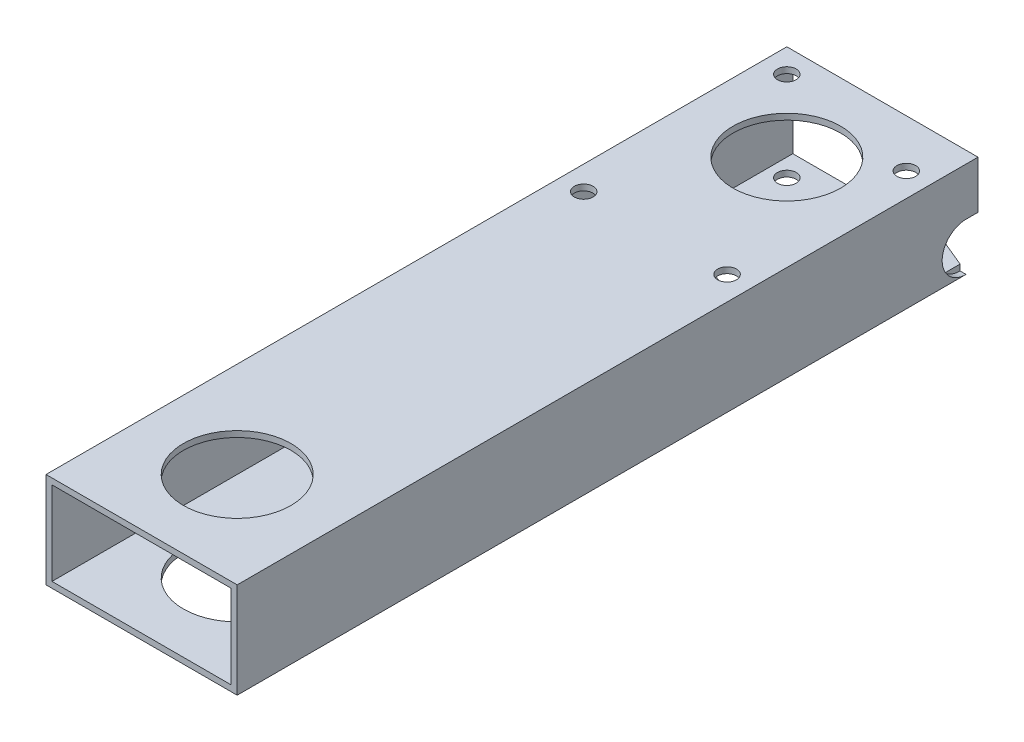
ISO-10303-21;
HEADER;
FILE_DESCRIPTION(('STEP AP214'),'2;1');
FILE_NAME('part.step','',(''),(''),'','','');
FILE_SCHEMA(('AUTOMOTIVE_DESIGN { 1 0 10303 214 1 1 1 1 }'));
ENDSEC;
DATA;
#1=APPLICATION_CONTEXT('core data for automotive mechanical design processes');
#2=APPLICATION_PROTOCOL_DEFINITION('international standard','automotive_design',2000,#1);
#3=PRODUCT_CONTEXT('',#1,'mechanical');
#4=PRODUCT('Part','Part','',(#3));
#5=PRODUCT_RELATED_PRODUCT_CATEGORY('part','',(#4));
#6=PRODUCT_DEFINITION_FORMATION('','',#4);
#7=PRODUCT_DEFINITION_CONTEXT('part definition',#1,'design');
#8=PRODUCT_DEFINITION('design','',#6,#7);
#9=PRODUCT_DEFINITION_SHAPE('','',#8);
#10=(LENGTH_UNIT() NAMED_UNIT(*) SI_UNIT(.MILLI.,.METRE.));
#11=(NAMED_UNIT(*) PLANE_ANGLE_UNIT() SI_UNIT($,.RADIAN.));
#12=(NAMED_UNIT(*) SI_UNIT($,.STERADIAN.) SOLID_ANGLE_UNIT());
#13=UNCERTAINTY_MEASURE_WITH_UNIT(LENGTH_MEASURE(1.E-05),#10,'distance_accuracy_value','');
#14=(GEOMETRIC_REPRESENTATION_CONTEXT(3) GLOBAL_UNCERTAINTY_ASSIGNED_CONTEXT((#13)) GLOBAL_UNIT_ASSIGNED_CONTEXT((#10,
#11,#12)) REPRESENTATION_CONTEXT('',''));
#15=CARTESIAN_POINT('',(0.,0.,0.));
#16=DIRECTION('',(0.,0.,1.));
#17=DIRECTION('',(1.,0.,0.));
#18=AXIS2_PLACEMENT_3D('',#15,#16,#17);
#19=CARTESIAN_POINT('',(0.,0.,98.4249994920001));
#20=DIRECTION('',(0.,0.,1.));
#21=DIRECTION('',(1.,0.,0.));
#22=AXIS2_PLACEMENT_3D('',#19,#20,#21);
#23=PLANE('',#22);
#24=DIRECTION('',(0.,-1.,0.));
#25=VECTOR('',#24,1.);
#26=CARTESIAN_POINT('',(-25.4,12.7,98.4249994920001));
#27=LINE('',#26,#25);
#28=CARTESIAN_POINT('',(-25.4,12.7,98.4249994920001));
#29=VERTEX_POINT('',#28);
#30=CARTESIAN_POINT('',(-25.4,-12.7,98.4249994920001));
#31=VERTEX_POINT('',#30);
#32=EDGE_CURVE('E192',#29,#31,#27,.T.);
#33=ORIENTED_EDGE('',*,*,#32,.T.);
#34=DIRECTION('',(1.,0.,0.));
#35=VECTOR('',#34,1.);
#36=CARTESIAN_POINT('',(-25.4,-12.7,98.4249994920001));
#37=LINE('',#36,#35);
#38=CARTESIAN_POINT('',(25.4,-12.7,98.4249994920001));
#39=VERTEX_POINT('',#38);
#40=EDGE_CURVE('E195',#31,#39,#37,.T.);
#41=ORIENTED_EDGE('',*,*,#40,.T.);
#42=DIRECTION('',(0.,1.,0.));
#43=VECTOR('',#42,1.);
#44=CARTESIAN_POINT('',(25.4,-12.7,98.4249994920001));
#45=LINE('',#44,#43);
#46=CARTESIAN_POINT('',(25.4,12.7,98.4249994920001));
#47=VERTEX_POINT('',#46);
#48=EDGE_CURVE('E197',#39,#47,#45,.T.);
#49=ORIENTED_EDGE('',*,*,#48,.T.);
#50=DIRECTION('',(-1.,0.,0.));
#51=VECTOR('',#50,1.);
#52=CARTESIAN_POINT('',(25.4,12.7,98.4249994920001));
#53=LINE('',#52,#51);
#54=EDGE_CURVE('E199',#47,#29,#53,.T.);
#55=ORIENTED_EDGE('',*,*,#54,.T.);
#56=EDGE_LOOP('',(#33,#41,#49,#55));
#57=FACE_BOUND('',#56,.T.);
#58=DIRECTION('',(1.,0.,0.));
#59=VECTOR('',#58,1.);
#60=CARTESIAN_POINT('',(-23.8125,-11.1125,98.4249994920001));
#61=LINE('',#60,#59);
#62=CARTESIAN_POINT('',(-23.8125,-11.1125,98.4249994920001));
#63=VERTEX_POINT('',#62);
#64=CARTESIAN_POINT('',(23.8125,-11.1125,98.4249994920001));
#65=VERTEX_POINT('',#64);
#66=EDGE_CURVE('E179',#63,#65,#61,.T.);
#67=ORIENTED_EDGE('',*,*,#66,.F.);
#68=DIRECTION('',(0.,-1.,0.));
#69=VECTOR('',#68,1.);
#70=CARTESIAN_POINT('',(-23.8125,11.1125,98.4249994920001));
#71=LINE('',#70,#69);
#72=CARTESIAN_POINT('',(-23.8125,11.1125,98.4249994920001));
#73=VERTEX_POINT('',#72);
#74=EDGE_CURVE('E177',#73,#63,#71,.T.);
#75=ORIENTED_EDGE('',*,*,#74,.F.);
#76=DIRECTION('',(-1.,0.,0.));
#77=VECTOR('',#76,1.);
#78=CARTESIAN_POINT('',(23.8125,11.1125,98.4249994920001));
#79=LINE('',#78,#77);
#80=CARTESIAN_POINT('',(23.8125,11.1125,98.4249994920001));
#81=VERTEX_POINT('',#80);
#82=EDGE_CURVE('E183',#81,#73,#79,.T.);
#83=ORIENTED_EDGE('',*,*,#82,.F.);
#84=DIRECTION('',(0.,1.,0.));
#85=VECTOR('',#84,1.);
#86=CARTESIAN_POINT('',(23.8125,-11.1125,98.4249994920001));
#87=LINE('',#86,#85);
#88=EDGE_CURVE('E181',#65,#81,#87,.T.);
#89=ORIENTED_EDGE('',*,*,#88,.F.);
#90=EDGE_LOOP('',(#67,#75,#83,#89));
#91=FACE_BOUND('',#90,.T.);
#92=ADVANCED_FACE('F43',(#57,#91),#23,.T.);
#93=CARTESIAN_POINT('',(-25.4,12.7,98.4249994920001));
#94=DIRECTION('',(1.,0.,0.));
#95=DIRECTION('',(0.,0.,-1.));
#96=AXIS2_PLACEMENT_3D('',#93,#94,#95);
#97=PLANE('',#96);
#98=DIRECTION('',(0.,0.,-1.));
#99=VECTOR('',#98,1.);
#100=CARTESIAN_POINT('',(-25.4,12.7,98.4249994920001));
#101=LINE('',#100,#99);
#102=CARTESIAN_POINT('',(-25.4,12.7,-98.4249994920001));
#103=VERTEX_POINT('',#102);
#104=EDGE_CURVE('E201',#29,#103,#101,.T.);
#105=ORIENTED_EDGE('',*,*,#104,.T.);
#106=DIRECTION('',(0.,-1.,0.));
#107=VECTOR('',#106,1.);
#108=CARTESIAN_POINT('',(-25.4,12.7,-98.4249994920001));
#109=LINE('',#108,#107);
#110=CARTESIAN_POINT('',(-25.4,-12.7,-98.4249994920001));
#111=VERTEX_POINT('',#110);
#112=EDGE_CURVE('E167',#103,#111,#109,.T.);
#113=ORIENTED_EDGE('',*,*,#112,.T.);
#114=DIRECTION('',(0.,0.,-1.));
#115=VECTOR('',#114,1.);
#116=CARTESIAN_POINT('',(-25.4,-12.7,98.4249994920001));
#117=LINE('',#116,#115);
#118=EDGE_CURVE('E11',#31,#111,#117,.T.);
#119=ORIENTED_EDGE('',*,*,#118,.F.);
#120=ORIENTED_EDGE('',*,*,#32,.F.);
#121=EDGE_LOOP('',(#105,#113,#119,#120));
#122=FACE_BOUND('',#121,.T.);
#123=ADVANCED_FACE('F45',(#122),#97,.F.);
#124=CARTESIAN_POINT('',(-25.4,-12.7,98.4249994920001));
#125=DIRECTION('',(0.,1.,0.));
#126=DIRECTION('',(-1.,0.,0.));
#127=AXIS2_PLACEMENT_3D('',#124,#125,#126);
#128=PLANE('',#127);
#129=CARTESIAN_POINT('',(19.0500000000008,-12.7,-85.7249994917966));
#130=DIRECTION('',(0.,-1.,0.));
#131=DIRECTION('',(0.,0.,-1.));
#132=AXIS2_PLACEMENT_3D('',#129,#130,#131);
#133=CIRCLE('',#132,2.48919999999999);
#134=CARTESIAN_POINT('',(19.0500000000008,-12.7,-88.2141994917966));
#135=VERTEX_POINT('',#134);
#136=EDGE_CURVE('E622',#135,#135,#133,.T.);
#137=ORIENTED_EDGE('',*,*,#136,.F.);
#138=EDGE_LOOP('',(#137));
#139=FACE_BOUND('',#138,.T.);
#140=CARTESIAN_POINT('',(-19.0500000000001,-12.7,-92.0749994917965));
#141=DIRECTION('',(0.,-1.,0.));
#142=DIRECTION('',(0.,0.,-1.));
#143=AXIS2_PLACEMENT_3D('',#140,#141,#142);
#144=CIRCLE('',#143,2.48919999999999);
#145=CARTESIAN_POINT('',(-19.0500000000001,-12.7,-94.5641994917965));
#146=VERTEX_POINT('',#145);
#147=EDGE_CURVE('E230',#146,#146,#144,.T.);
#148=ORIENTED_EDGE('',*,*,#147,.F.);
#149=EDGE_LOOP('',(#148));
#150=FACE_BOUND('',#149,.T.);
#151=CARTESIAN_POINT('',(-19.0500000000001,-12.7,-38.0999994917965));
#152=DIRECTION('',(0.,-1.,0.));
#153=DIRECTION('',(0.,0.,-1.));
#154=AXIS2_PLACEMENT_3D('',#151,#152,#153);
#155=CIRCLE('',#154,2.48919999999999);
#156=CARTESIAN_POINT('',(-19.0500000000001,-12.7,-40.5891994917965));
#157=VERTEX_POINT('',#156);
#158=EDGE_CURVE('E227',#157,#157,#155,.T.);
#159=ORIENTED_EDGE('',*,*,#158,.F.);
#160=EDGE_LOOP('',(#159));
#161=FACE_BOUND('',#160,.T.);
#162=CARTESIAN_POINT('',(19.0500000000007,-12.7,-38.0999994917965));
#163=DIRECTION('',(0.,-1.,0.));
#164=DIRECTION('',(0.,0.,-1.));
#165=AXIS2_PLACEMENT_3D('',#162,#163,#164);
#166=CIRCLE('',#165,2.48919999999999);
#167=CARTESIAN_POINT('',(19.0500000000007,-12.7,-40.5891994917965));
#168=VERTEX_POINT('',#167);
#169=EDGE_CURVE('E245',#168,#168,#166,.T.);
#170=ORIENTED_EDGE('',*,*,#169,.F.);
#171=EDGE_LOOP('',(#170));
#172=FACE_BOUND('',#171,.T.);
#173=CARTESIAN_POINT('',(0.,-12.7,-73.025));
#174=DIRECTION('',(0.,-1.,0.));
#175=DIRECTION('',(1.,0.,0.));
#176=AXIS2_PLACEMENT_3D('',#173,#174,#175);
#177=CIRCLE('',#176,14.2875);
#178=CARTESIAN_POINT('',(14.2875,-12.7,-73.025));
#179=VERTEX_POINT('',#178);
#180=EDGE_CURVE('E281',#179,#179,#177,.T.);
#181=ORIENTED_EDGE('',*,*,#180,.F.);
#182=EDGE_LOOP('',(#181));
#183=FACE_BOUND('',#182,.T.);
#184=CARTESIAN_POINT('',(0.,-12.7,73.025));
#185=DIRECTION('',(0.,-1.,0.));
#186=DIRECTION('',(1.,0.,0.));
#187=AXIS2_PLACEMENT_3D('',#184,#185,#186);
#188=CIRCLE('',#187,14.2875);
#189=CARTESIAN_POINT('',(14.2875,-12.7,73.025));
#190=VERTEX_POINT('',#189);
#191=EDGE_CURVE('E284',#190,#190,#188,.T.);
#192=ORIENTED_EDGE('',*,*,#191,.F.);
#193=EDGE_LOOP('',(#192));
#194=FACE_BOUND('',#193,.T.);
#195=DIRECTION('',(1.,0.,0.));
#196=VECTOR('',#195,1.);
#197=CARTESIAN_POINT('',(-25.4,-12.7,-98.4249994920001));
#198=LINE('',#197,#196);
#199=CARTESIAN_POINT('',(16.1925,-12.7,-98.4249994920001));
#200=VERTEX_POINT('',#199);
#201=EDGE_CURVE('E170',#111,#200,#198,.T.);
#202=ORIENTED_EDGE('',*,*,#201,.T.);
#203=DIRECTION('',(-0.923076923076923,0.,-0.384615384615384));
#204=VECTOR('',#203,1.);
#205=CARTESIAN_POINT('',(23.8125,-12.7,-95.2499994920001));
#206=LINE('',#205,#204);
#207=CARTESIAN_POINT('',(23.8125,-12.7,-95.2499994920001));
#208=VERTEX_POINT('',#207);
#209=EDGE_CURVE('E135',#208,#200,#206,.T.);
#210=ORIENTED_EDGE('',*,*,#209,.F.);
#211=DIRECTION('',(1.,0.,0.));
#212=VECTOR('',#211,1.);
#213=CARTESIAN_POINT('',(23.8125,-12.7,-95.2499994920001));
#214=LINE('',#213,#212);
#215=CARTESIAN_POINT('',(25.4,-12.7,-95.2499994920001));
#216=VERTEX_POINT('',#215);
#217=EDGE_CURVE('E266',#208,#216,#214,.T.);
#218=ORIENTED_EDGE('',*,*,#217,.T.);
#219=DIRECTION('',(0.,0.,-1.));
#220=VECTOR('',#219,1.);
#221=CARTESIAN_POINT('',(25.4,-12.7,98.4249994920001));
#222=LINE('',#221,#220);
#223=EDGE_CURVE('E52',#39,#216,#222,.T.);
#224=ORIENTED_EDGE('',*,*,#223,.F.);
#225=ORIENTED_EDGE('',*,*,#40,.F.);
#226=ORIENTED_EDGE('',*,*,#118,.T.);
#227=EDGE_LOOP('',(#202,#210,#218,#224,#225,#226));
#228=FACE_BOUND('',#227,.T.);
#229=ADVANCED_FACE('F311',(#139,#150,#161,#172,#183,#194,#228),#128,.F.);
#230=CARTESIAN_POINT('',(25.4,-12.7,98.4249994920001));
#231=DIRECTION('',(-1.,0.,0.));
#232=DIRECTION('',(0.,0.,1.));
#233=AXIS2_PLACEMENT_3D('',#230,#231,#232);
#234=PLANE('',#233);
#235=ORIENTED_EDGE('',*,*,#223,.T.);
#236=CARTESIAN_POINT('',(25.4,-6.35,-95.2499994920001));
#237=DIRECTION('',(1.,0.,0.));
#238=DIRECTION('',(0.,0.,-1.));
#239=AXIS2_PLACEMENT_3D('',#236,#237,#238);
#240=CIRCLE('',#239,6.35);
#241=CARTESIAN_POINT('',(25.4,0.,-95.2499994920001));
#242=VERTEX_POINT('',#241);
#243=EDGE_CURVE('E140',#242,#216,#240,.T.);
#244=ORIENTED_EDGE('',*,*,#243,.F.);
#245=DIRECTION('',(0.,0.,1.));
#246=VECTOR('',#245,1.);
#247=CARTESIAN_POINT('',(25.4,0.,-95.2499994920001));
#248=LINE('',#247,#246);
#249=CARTESIAN_POINT('',(25.4,0.,-98.4249994920001));
#250=VERTEX_POINT('',#249);
#251=EDGE_CURVE('E268',#250,#242,#248,.T.);
#252=ORIENTED_EDGE('',*,*,#251,.F.);
#253=DIRECTION('',(0.,1.,0.));
#254=VECTOR('',#253,1.);
#255=CARTESIAN_POINT('',(25.4,-12.7,-98.4249994920001));
#256=LINE('',#255,#254);
#257=CARTESIAN_POINT('',(25.4,12.7,-98.4249994920001));
#258=VERTEX_POINT('',#257);
#259=EDGE_CURVE('E172',#250,#258,#256,.T.);
#260=ORIENTED_EDGE('',*,*,#259,.T.);
#261=DIRECTION('',(0.,0.,-1.));
#262=VECTOR('',#261,1.);
#263=CARTESIAN_POINT('',(25.4,12.7,98.4249994920001));
#264=LINE('',#263,#262);
#265=EDGE_CURVE('E203',#47,#258,#264,.T.);
#266=ORIENTED_EDGE('',*,*,#265,.F.);
#267=ORIENTED_EDGE('',*,*,#48,.F.);
#268=EDGE_LOOP('',(#235,#244,#252,#260,#266,#267));
#269=FACE_BOUND('',#268,.T.);
#270=ADVANCED_FACE('F314',(#269),#234,.F.);
#271=CARTESIAN_POINT('',(25.4,12.7,98.4249994920001));
#272=DIRECTION('',(0.,-1.,0.));
#273=DIRECTION('',(1.,0.,0.));
#274=AXIS2_PLACEMENT_3D('',#271,#272,#273);
#275=PLANE('',#274);
#276=CARTESIAN_POINT('',(19.0500000000008,12.7,-85.7249994917966));
#277=DIRECTION('',(0.,-1.,0.));
#278=DIRECTION('',(0.,0.,-1.));
#279=AXIS2_PLACEMENT_3D('',#276,#277,#278);
#280=CIRCLE('',#279,2.48919999999999);
#281=CARTESIAN_POINT('',(19.0500000000008,12.7,-88.2141994917966));
#282=VERTEX_POINT('',#281);
#283=EDGE_CURVE('E623',#282,#282,#280,.T.);
#284=ORIENTED_EDGE('',*,*,#283,.T.);
#285=EDGE_LOOP('',(#284));
#286=FACE_BOUND('',#285,.T.);
#287=CARTESIAN_POINT('',(-19.0500000000001,12.7,-92.0749994917965));
#288=DIRECTION('',(0.,-1.,0.));
#289=DIRECTION('',(0.,0.,-1.));
#290=AXIS2_PLACEMENT_3D('',#287,#288,#289);
#291=CIRCLE('',#290,2.48919999999999);
#292=CARTESIAN_POINT('',(-19.0500000000001,12.7,-94.5641994917965));
#293=VERTEX_POINT('',#292);
#294=EDGE_CURVE('E223',#293,#293,#291,.T.);
#295=ORIENTED_EDGE('',*,*,#294,.T.);
#296=EDGE_LOOP('',(#295));
#297=FACE_BOUND('',#296,.T.);
#298=CARTESIAN_POINT('',(-19.0500000000001,12.7,-38.0999994917965));
#299=DIRECTION('',(0.,-1.,0.));
#300=DIRECTION('',(0.,0.,-1.));
#301=AXIS2_PLACEMENT_3D('',#298,#299,#300);
#302=CIRCLE('',#301,2.48919999999999);
#303=CARTESIAN_POINT('',(-19.0500000000001,12.7,-40.5891994917965));
#304=VERTEX_POINT('',#303);
#305=EDGE_CURVE('E219',#304,#304,#302,.T.);
#306=ORIENTED_EDGE('',*,*,#305,.T.);
#307=EDGE_LOOP('',(#306));
#308=FACE_BOUND('',#307,.T.);
#309=CARTESIAN_POINT('',(19.0500000000007,12.7,-38.0999994917965));
#310=DIRECTION('',(0.,-1.,0.));
#311=DIRECTION('',(0.,0.,-1.));
#312=AXIS2_PLACEMENT_3D('',#309,#310,#311);
#313=CIRCLE('',#312,2.48919999999999);
#314=CARTESIAN_POINT('',(19.0500000000007,12.7,-40.5891994917965));
#315=VERTEX_POINT('',#314);
#316=EDGE_CURVE('E248',#315,#315,#313,.T.);
#317=ORIENTED_EDGE('',*,*,#316,.T.);
#318=EDGE_LOOP('',(#317));
#319=FACE_BOUND('',#318,.T.);
#320=CARTESIAN_POINT('',(0.,12.7,-73.025));
#321=DIRECTION('',(0.,-1.,0.));
#322=DIRECTION('',(1.,0.,0.));
#323=AXIS2_PLACEMENT_3D('',#320,#321,#322);
#324=CIRCLE('',#323,14.2875);
#325=CARTESIAN_POINT('',(14.2875,12.7,-73.025));
#326=VERTEX_POINT('',#325);
#327=EDGE_CURVE('E212',#326,#326,#324,.T.);
#328=ORIENTED_EDGE('',*,*,#327,.T.);
#329=EDGE_LOOP('',(#328));
#330=FACE_BOUND('',#329,.T.);
#331=CARTESIAN_POINT('',(0.,12.7,73.025));
#332=DIRECTION('',(0.,-1.,0.));
#333=DIRECTION('',(1.,0.,0.));
#334=AXIS2_PLACEMENT_3D('',#331,#332,#333);
#335=CIRCLE('',#334,14.2875);
#336=CARTESIAN_POINT('',(14.2875,12.7,73.025));
#337=VERTEX_POINT('',#336);
#338=EDGE_CURVE('E278',#337,#337,#335,.T.);
#339=ORIENTED_EDGE('',*,*,#338,.T.);
#340=EDGE_LOOP('',(#339));
#341=FACE_BOUND('',#340,.T.);
#342=ORIENTED_EDGE('',*,*,#265,.T.);
#343=DIRECTION('',(-1.,0.,0.));
#344=VECTOR('',#343,1.);
#345=CARTESIAN_POINT('',(25.4,12.7,-98.4249994920001));
#346=LINE('',#345,#344);
#347=EDGE_CURVE('E174',#258,#103,#346,.T.);
#348=ORIENTED_EDGE('',*,*,#347,.T.);
#349=ORIENTED_EDGE('',*,*,#104,.F.);
#350=ORIENTED_EDGE('',*,*,#54,.F.);
#351=EDGE_LOOP('',(#342,#348,#349,#350));
#352=FACE_BOUND('',#351,.T.);
#353=ADVANCED_FACE('F325',(#286,#297,#308,#319,#330,#341,#352),#275,.F.);
#354=CARTESIAN_POINT('',(-23.8125,11.1125,98.4249994920001));
#355=DIRECTION('',(1.,0.,0.));
#356=DIRECTION('',(0.,1.,0.));
#357=AXIS2_PLACEMENT_3D('',#354,#355,#356);
#358=PLANE('',#357);
#359=DIRECTION('',(0.,0.,-1.));
#360=VECTOR('',#359,1.);
#361=CARTESIAN_POINT('',(-23.8125,-11.1125,98.4249994920001));
#362=LINE('',#361,#360);
#363=CARTESIAN_POINT('',(-23.8125,-11.1125,-98.4249994920001));
#364=VERTEX_POINT('',#363);
#365=EDGE_CURVE('E190',#63,#364,#362,.T.);
#366=ORIENTED_EDGE('',*,*,#365,.T.);
#367=DIRECTION('',(0.,-1.,0.));
#368=VECTOR('',#367,1.);
#369=CARTESIAN_POINT('',(-23.8125,11.1125,-98.4249994920001));
#370=LINE('',#369,#368);
#371=CARTESIAN_POINT('',(-23.8125,11.1125,-98.4249994920001));
#372=VERTEX_POINT('',#371);
#373=EDGE_CURVE('E157',#372,#364,#370,.T.);
#374=ORIENTED_EDGE('',*,*,#373,.F.);
#375=DIRECTION('',(0.,0.,-1.));
#376=VECTOR('',#375,1.);
#377=CARTESIAN_POINT('',(-23.8125,11.1125,98.4249994920001));
#378=LINE('',#377,#376);
#379=EDGE_CURVE('E185',#73,#372,#378,.T.);
#380=ORIENTED_EDGE('',*,*,#379,.F.);
#381=ORIENTED_EDGE('',*,*,#74,.T.);
#382=EDGE_LOOP('',(#366,#374,#380,#381));
#383=FACE_BOUND('',#382,.T.);
#384=ADVANCED_FACE('F298',(#383),#358,.T.);
#385=CARTESIAN_POINT('',(-23.8125,-11.1125,98.4249994920001));
#386=DIRECTION('',(0.,1.,0.));
#387=DIRECTION('',(0.,0.,1.));
#388=AXIS2_PLACEMENT_3D('',#385,#386,#387);
#389=PLANE('',#388);
#390=CARTESIAN_POINT('',(19.0500000000008,-11.1125,-85.7249994917966));
#391=DIRECTION('',(0.,1.,0.));
#392=DIRECTION('',(0.,0.,1.));
#393=AXIS2_PLACEMENT_3D('',#390,#391,#392);
#394=CIRCLE('',#393,2.48919999999999);
#395=CARTESIAN_POINT('',(19.0500000000008,-11.1125,-83.2357994917966));
#396=VERTEX_POINT('',#395);
#397=EDGE_CURVE('E235',#396,#396,#394,.T.);
#398=ORIENTED_EDGE('',*,*,#397,.F.);
#399=EDGE_LOOP('',(#398));
#400=FACE_BOUND('',#399,.T.);
#401=CARTESIAN_POINT('',(-19.0500000000001,-11.1125,-92.0749994917965));
#402=DIRECTION('',(0.,1.,0.));
#403=DIRECTION('',(0.,0.,1.));
#404=AXIS2_PLACEMENT_3D('',#401,#402,#403);
#405=CIRCLE('',#404,2.48919999999999);
#406=CARTESIAN_POINT('',(-19.0500000000001,-11.1125,-89.5857994917965));
#407=VERTEX_POINT('',#406);
#408=EDGE_CURVE('E222',#407,#407,#405,.T.);
#409=ORIENTED_EDGE('',*,*,#408,.F.);
#410=EDGE_LOOP('',(#409));
#411=FACE_BOUND('',#410,.T.);
#412=CARTESIAN_POINT('',(-19.0500000000001,-11.1125,-38.0999994917965));
#413=DIRECTION('',(0.,1.,0.));
#414=DIRECTION('',(0.,0.,1.));
#415=AXIS2_PLACEMENT_3D('',#412,#413,#414);
#416=CIRCLE('',#415,2.48919999999999);
#417=CARTESIAN_POINT('',(-19.0500000000001,-11.1125,-35.6107994917966));
#418=VERTEX_POINT('',#417);
#419=EDGE_CURVE('E216',#418,#418,#416,.T.);
#420=ORIENTED_EDGE('',*,*,#419,.F.);
#421=EDGE_LOOP('',(#420));
#422=FACE_BOUND('',#421,.T.);
#423=CARTESIAN_POINT('',(19.0500000000007,-11.1125,-38.0999994917965));
#424=DIRECTION('',(0.,1.,0.));
#425=DIRECTION('',(0.,0.,1.));
#426=AXIS2_PLACEMENT_3D('',#423,#424,#425);
#427=CIRCLE('',#426,2.48919999999999);
#428=CARTESIAN_POINT('',(19.0500000000007,-11.1125,-35.6107994917965));
#429=VERTEX_POINT('',#428);
#430=EDGE_CURVE('E254',#429,#429,#427,.T.);
#431=ORIENTED_EDGE('',*,*,#430,.F.);
#432=EDGE_LOOP('',(#431));
#433=FACE_BOUND('',#432,.T.);
#434=DIRECTION('',(-0.923076923076923,0.,-0.384615384615384));
#435=VECTOR('',#434,1.);
#436=CARTESIAN_POINT('',(23.8125,-11.1125,-95.2499994920001));
#437=LINE('',#436,#435);
#438=CARTESIAN_POINT('',(23.8125,-11.1125,-95.2499994920001));
#439=VERTEX_POINT('',#438);
#440=CARTESIAN_POINT('',(16.1925,-11.1125,-98.4249994920001));
#441=VERTEX_POINT('',#440);
#442=EDGE_CURVE('E60',#439,#441,#437,.T.);
#443=ORIENTED_EDGE('',*,*,#442,.T.);
#444=DIRECTION('',(1.,0.,0.));
#445=VECTOR('',#444,1.);
#446=CARTESIAN_POINT('',(-23.8125,-11.1125,-98.4249994920001));
#447=LINE('',#446,#445);
#448=EDGE_CURVE('E149',#364,#441,#447,.T.);
#449=ORIENTED_EDGE('',*,*,#448,.F.);
#450=ORIENTED_EDGE('',*,*,#365,.F.);
#451=ORIENTED_EDGE('',*,*,#66,.T.);
#452=DIRECTION('',(0.,0.,-1.));
#453=VECTOR('',#452,1.);
#454=CARTESIAN_POINT('',(23.8125,-11.1125,98.4249994920001));
#455=LINE('',#454,#453);
#456=CARTESIAN_POINT('',(23.8125,-11.1125,-91.0498692856851));
#457=VERTEX_POINT('',#456);
#458=EDGE_CURVE('E188',#65,#457,#455,.T.);
#459=ORIENTED_EDGE('',*,*,#458,.T.);
#460=DIRECTION('',(0.,0.,-1.));
#461=VECTOR('',#460,1.);
#462=CARTESIAN_POINT('',(23.8125,-11.1125,98.4249994920001));
#463=LINE('',#462,#461);
#464=EDGE_CURVE('E152',#457,#439,#463,.T.);
#465=ORIENTED_EDGE('',*,*,#464,.T.);
#466=EDGE_LOOP('',(#443,#449,#450,#451,#459,#465));
#467=FACE_BOUND('',#466,.T.);
#468=CARTESIAN_POINT('',(0.,-11.1125,-73.025));
#469=DIRECTION('',(0.,1.,0.));
#470=DIRECTION('',(0.,0.,1.));
#471=AXIS2_PLACEMENT_3D('',#468,#469,#470);
#472=CIRCLE('',#471,14.2875);
#473=CARTESIAN_POINT('',(0.,-11.1125,-58.7375));
#474=VERTEX_POINT('',#473);
#475=EDGE_CURVE('E162',#474,#474,#472,.T.);
#476=ORIENTED_EDGE('',*,*,#475,.F.);
#477=EDGE_LOOP('',(#476));
#478=FACE_BOUND('',#477,.T.);
#479=CARTESIAN_POINT('',(0.,-11.1125,73.025));
#480=DIRECTION('',(0.,1.,0.));
#481=DIRECTION('',(0.,0.,1.));
#482=AXIS2_PLACEMENT_3D('',#479,#480,#481);
#483=CIRCLE('',#482,14.2875);
#484=CARTESIAN_POINT('',(0.,-11.1125,87.3125));
#485=VERTEX_POINT('',#484);
#486=EDGE_CURVE('E211',#485,#485,#483,.T.);
#487=ORIENTED_EDGE('',*,*,#486,.F.);
#488=EDGE_LOOP('',(#487));
#489=FACE_BOUND('',#488,.T.);
#490=ADVANCED_FACE('F146',(#400,#411,#422,#433,#467,#478,#489),#389,.T.);
#491=CARTESIAN_POINT('',(23.8125,-11.1125,98.4249994920001));
#492=DIRECTION('',(-1.,0.,0.));
#493=DIRECTION('',(0.,0.,1.));
#494=AXIS2_PLACEMENT_3D('',#491,#492,#493);
#495=PLANE('',#494);
#496=CARTESIAN_POINT('',(23.8125,-6.35,-95.2499994920001));
#497=DIRECTION('',(1.,0.,0.));
#498=DIRECTION('',(0.,0.,-1.));
#499=AXIS2_PLACEMENT_3D('',#496,#497,#498);
#500=CIRCLE('',#499,6.35);
#501=CARTESIAN_POINT('',(23.8125,0.,-95.2499994920001));
#502=VERTEX_POINT('',#501);
#503=EDGE_CURVE('E259',#502,#457,#500,.T.);
#504=ORIENTED_EDGE('',*,*,#503,.T.);
#505=ORIENTED_EDGE('',*,*,#458,.F.);
#506=ORIENTED_EDGE('',*,*,#88,.T.);
#507=DIRECTION('',(0.,0.,-1.));
#508=VECTOR('',#507,1.);
#509=CARTESIAN_POINT('',(23.8125,11.1125,98.4249994920001));
#510=LINE('',#509,#508);
#511=CARTESIAN_POINT('',(23.8125,11.1125,-98.4249994920001));
#512=VERTEX_POINT('',#511);
#513=EDGE_CURVE('E68',#81,#512,#510,.T.);
#514=ORIENTED_EDGE('',*,*,#513,.T.);
#515=DIRECTION('',(0.,1.,0.));
#516=VECTOR('',#515,1.);
#517=CARTESIAN_POINT('',(23.8125,-11.1125,-98.4249994920001));
#518=LINE('',#517,#516);
#519=CARTESIAN_POINT('',(23.8125,0.,-98.4249994920001));
#520=VERTEX_POINT('',#519);
#521=EDGE_CURVE('E158',#520,#512,#518,.T.);
#522=ORIENTED_EDGE('',*,*,#521,.F.);
#523=DIRECTION('',(0.,0.,1.));
#524=VECTOR('',#523,1.);
#525=CARTESIAN_POINT('',(23.8125,0.,-95.2499994920001));
#526=LINE('',#525,#524);
#527=EDGE_CURVE('E262',#520,#502,#526,.T.);
#528=ORIENTED_EDGE('',*,*,#527,.T.);
#529=EDGE_LOOP('',(#504,#505,#506,#514,#522,#528));
#530=FACE_BOUND('',#529,.T.);
#531=ADVANCED_FACE('F297',(#530),#495,.T.);
#532=CARTESIAN_POINT('',(23.8125,11.1125,98.4249994920001));
#533=DIRECTION('',(0.,-1.,0.));
#534=DIRECTION('',(0.,0.,-1.));
#535=AXIS2_PLACEMENT_3D('',#532,#533,#534);
#536=PLANE('',#535);
#537=CARTESIAN_POINT('',(19.0500000000008,11.1125,-85.7249994917966));
#538=DIRECTION('',(0.,-1.,0.));
#539=DIRECTION('',(0.,0.,-1.));
#540=AXIS2_PLACEMENT_3D('',#537,#538,#539);
#541=CIRCLE('',#540,2.48919999999999);
#542=CARTESIAN_POINT('',(19.0500000000008,11.1125,-88.2141994917966));
#543=VERTEX_POINT('',#542);
#544=EDGE_CURVE('E47',#543,#543,#541,.T.);
#545=ORIENTED_EDGE('',*,*,#544,.F.);
#546=EDGE_LOOP('',(#545));
#547=FACE_BOUND('',#546,.T.);
#548=CARTESIAN_POINT('',(-19.0500000000001,11.1125,-92.0749994917965));
#549=DIRECTION('',(0.,-1.,0.));
#550=DIRECTION('',(0.,0.,-1.));
#551=AXIS2_PLACEMENT_3D('',#548,#549,#550);
#552=CIRCLE('',#551,2.48919999999999);
#553=CARTESIAN_POINT('',(-19.0500000000001,11.1125,-94.5641994917965));
#554=VERTEX_POINT('',#553);
#555=EDGE_CURVE('E220',#554,#554,#552,.T.);
#556=ORIENTED_EDGE('',*,*,#555,.F.);
#557=EDGE_LOOP('',(#556));
#558=FACE_BOUND('',#557,.T.);
#559=CARTESIAN_POINT('',(-19.0500000000001,11.1125,-38.0999994917965));
#560=DIRECTION('',(0.,-1.,0.));
#561=DIRECTION('',(0.,0.,-1.));
#562=AXIS2_PLACEMENT_3D('',#559,#560,#561);
#563=CIRCLE('',#562,2.48919999999999);
#564=CARTESIAN_POINT('',(-19.0500000000001,11.1125,-40.5891994917965));
#565=VERTEX_POINT('',#564);
#566=EDGE_CURVE('E218',#565,#565,#563,.T.);
#567=ORIENTED_EDGE('',*,*,#566,.F.);
#568=EDGE_LOOP('',(#567));
#569=FACE_BOUND('',#568,.T.);
#570=CARTESIAN_POINT('',(19.0500000000007,11.1125,-38.0999994917965));
#571=DIRECTION('',(0.,-1.,0.));
#572=DIRECTION('',(0.,0.,-1.));
#573=AXIS2_PLACEMENT_3D('',#570,#571,#572);
#574=CIRCLE('',#573,2.48919999999999);
#575=CARTESIAN_POINT('',(19.0500000000007,11.1125,-40.5891994917965));
#576=VERTEX_POINT('',#575);
#577=EDGE_CURVE('E251',#576,#576,#574,.T.);
#578=ORIENTED_EDGE('',*,*,#577,.F.);
#579=EDGE_LOOP('',(#578));
#580=FACE_BOUND('',#579,.T.);
#581=CARTESIAN_POINT('',(0.,11.1125,-73.025));
#582=DIRECTION('',(0.,-1.,0.));
#583=DIRECTION('',(0.,0.,-1.));
#584=AXIS2_PLACEMENT_3D('',#581,#582,#583);
#585=CIRCLE('',#584,14.2875);
#586=CARTESIAN_POINT('',(0.,11.1125,-87.3125));
#587=VERTEX_POINT('',#586);
#588=EDGE_CURVE('E213',#587,#587,#585,.T.);
#589=ORIENTED_EDGE('',*,*,#588,.F.);
#590=EDGE_LOOP('',(#589));
#591=FACE_BOUND('',#590,.T.);
#592=CARTESIAN_POINT('',(0.,11.1125,73.025));
#593=DIRECTION('',(0.,-1.,0.));
#594=DIRECTION('',(0.,0.,-1.));
#595=AXIS2_PLACEMENT_3D('',#592,#593,#594);
#596=CIRCLE('',#595,14.2875);
#597=CARTESIAN_POINT('',(0.,11.1125,58.7375));
#598=VERTEX_POINT('',#597);
#599=EDGE_CURVE('E208',#598,#598,#596,.T.);
#600=ORIENTED_EDGE('',*,*,#599,.F.);
#601=EDGE_LOOP('',(#600));
#602=FACE_BOUND('',#601,.T.);
#603=ORIENTED_EDGE('',*,*,#379,.T.);
#604=DIRECTION('',(-1.,0.,0.));
#605=VECTOR('',#604,1.);
#606=CARTESIAN_POINT('',(23.8125,11.1125,-98.4249994920001));
#607=LINE('',#606,#605);
#608=EDGE_CURVE('E160',#512,#372,#607,.T.);
#609=ORIENTED_EDGE('',*,*,#608,.F.);
#610=ORIENTED_EDGE('',*,*,#513,.F.);
#611=ORIENTED_EDGE('',*,*,#82,.T.);
#612=EDGE_LOOP('',(#603,#609,#610,#611));
#613=FACE_BOUND('',#612,.T.);
#614=ADVANCED_FACE('F339',(#547,#558,#569,#580,#591,#602,#613),#536,.T.);
#615=CARTESIAN_POINT('',(0.,0.,-98.4249994920001));
#616=DIRECTION('',(0.,0.,1.));
#617=DIRECTION('',(1.,0.,0.));
#618=AXIS2_PLACEMENT_3D('',#615,#616,#617);
#619=PLANE('',#618);
#620=ORIENTED_EDGE('',*,*,#448,.T.);
#621=DIRECTION('',(0.,-1.,0.));
#622=VECTOR('',#621,1.);
#623=CARTESIAN_POINT('',(16.1925,-11.1125,-98.4249994920001));
#624=LINE('',#623,#622);
#625=EDGE_CURVE('E132',#441,#200,#624,.T.);
#626=ORIENTED_EDGE('',*,*,#625,.T.);
#627=ORIENTED_EDGE('',*,*,#201,.F.);
#628=ORIENTED_EDGE('',*,*,#112,.F.);
#629=ORIENTED_EDGE('',*,*,#347,.F.);
#630=ORIENTED_EDGE('',*,*,#259,.F.);
#631=DIRECTION('',(1.,0.,0.));
#632=VECTOR('',#631,1.);
#633=CARTESIAN_POINT('',(23.8125,0.,-98.4249994920001));
#634=LINE('',#633,#632);
#635=EDGE_CURVE('E273',#520,#250,#634,.T.);
#636=ORIENTED_EDGE('',*,*,#635,.F.);
#637=ORIENTED_EDGE('',*,*,#521,.T.);
#638=ORIENTED_EDGE('',*,*,#608,.T.);
#639=ORIENTED_EDGE('',*,*,#373,.T.);
#640=EDGE_LOOP('',(#620,#626,#627,#628,#629,#630,#636,#637,#638,#639));
#641=FACE_BOUND('',#640,.T.);
#642=ADVANCED_FACE('F154',(#641),#619,.F.);
#643=CARTESIAN_POINT('',(0.,12.7,73.025));
#644=DIRECTION('',(0.,-1.,0.));
#645=DIRECTION('',(1.,0.,0.));
#646=AXIS2_PLACEMENT_3D('',#643,#644,#645);
#647=CYLINDRICAL_SURFACE('',#646,14.2875);
#648=ORIENTED_EDGE('',*,*,#599,.T.);
#649=EDGE_LOOP('',(#648));
#650=FACE_BOUND('',#649,.T.);
#651=ORIENTED_EDGE('',*,*,#338,.F.);
#652=EDGE_LOOP('',(#651));
#653=FACE_BOUND('',#652,.T.);
#654=ADVANCED_FACE('F308',(#650,#653),#647,.F.);
#655=CARTESIAN_POINT('',(0.,12.7,-73.025));
#656=DIRECTION('',(0.,-1.,0.));
#657=DIRECTION('',(1.,0.,0.));
#658=AXIS2_PLACEMENT_3D('',#655,#656,#657);
#659=CYLINDRICAL_SURFACE('',#658,14.2875);
#660=ORIENTED_EDGE('',*,*,#588,.T.);
#661=EDGE_LOOP('',(#660));
#662=FACE_BOUND('',#661,.T.);
#663=ORIENTED_EDGE('',*,*,#327,.F.);
#664=EDGE_LOOP('',(#663));
#665=FACE_BOUND('',#664,.T.);
#666=ADVANCED_FACE('F306',(#662,#665),#659,.F.);
#667=ORIENTED_EDGE('',*,*,#486,.T.);
#668=EDGE_LOOP('',(#667));
#669=FACE_BOUND('',#668,.T.);
#670=ORIENTED_EDGE('',*,*,#191,.T.);
#671=EDGE_LOOP('',(#670));
#672=FACE_BOUND('',#671,.T.);
#673=ADVANCED_FACE('F303',(#669,#672),#647,.F.);
#674=ORIENTED_EDGE('',*,*,#475,.T.);
#675=EDGE_LOOP('',(#674));
#676=FACE_BOUND('',#675,.T.);
#677=ORIENTED_EDGE('',*,*,#180,.T.);
#678=EDGE_LOOP('',(#677));
#679=FACE_BOUND('',#678,.T.);
#680=ADVANCED_FACE('F293',(#676,#679),#659,.F.);
#681=CARTESIAN_POINT('',(23.8125,-6.35,-95.2499994920001));
#682=DIRECTION('',(1.,0.,0.));
#683=DIRECTION('',(0.,0.,-1.));
#684=AXIS2_PLACEMENT_3D('',#681,#682,#683);
#685=CYLINDRICAL_SURFACE('',#684,6.35);
#686=ORIENTED_EDGE('',*,*,#243,.T.);
#687=ORIENTED_EDGE('',*,*,#217,.F.);
#688=EDGE_CURVE('E263',#457,#208,#500,.T.);
#689=ORIENTED_EDGE('',*,*,#688,.F.);
#690=ORIENTED_EDGE('',*,*,#503,.F.);
#691=DIRECTION('',(1.,0.,0.));
#692=VECTOR('',#691,1.);
#693=CARTESIAN_POINT('',(23.8125,0.,-95.2499994920001));
#694=LINE('',#693,#692);
#695=EDGE_CURVE('E271',#502,#242,#694,.T.);
#696=ORIENTED_EDGE('',*,*,#695,.T.);
#697=EDGE_LOOP('',(#686,#687,#689,#690,#696));
#698=FACE_BOUND('',#697,.T.);
#699=ADVANCED_FACE('F432',(#698),#685,.F.);
#700=CARTESIAN_POINT('',(23.8125,0.,-95.2499994920001));
#701=DIRECTION('',(0.,1.,0.));
#702=DIRECTION('',(0.,0.,1.));
#703=AXIS2_PLACEMENT_3D('',#700,#701,#702);
#704=PLANE('',#703);
#705=ORIENTED_EDGE('',*,*,#251,.T.);
#706=ORIENTED_EDGE('',*,*,#695,.F.);
#707=ORIENTED_EDGE('',*,*,#527,.F.);
#708=ORIENTED_EDGE('',*,*,#635,.T.);
#709=EDGE_LOOP('',(#705,#706,#707,#708));
#710=FACE_BOUND('',#709,.T.);
#711=ADVANCED_FACE('F335',(#710),#704,.F.);
#712=CARTESIAN_POINT('',(23.8125,-6.35,-95.2499994920001));
#713=DIRECTION('',(1.,0.,0.));
#714=DIRECTION('',(0.,0.,-1.));
#715=AXIS2_PLACEMENT_3D('',#712,#713,#714);
#716=PLANE('',#715);
#717=DIRECTION('',(0.,-1.,0.));
#718=VECTOR('',#717,1.);
#719=CARTESIAN_POINT('',(23.8125,-11.1125,-95.2499994920001));
#720=LINE('',#719,#718);
#721=EDGE_CURVE('E141',#439,#208,#720,.T.);
#722=ORIENTED_EDGE('',*,*,#721,.F.);
#723=ORIENTED_EDGE('',*,*,#464,.F.);
#724=ORIENTED_EDGE('',*,*,#688,.T.);
#725=EDGE_LOOP('',(#722,#723,#724));
#726=FACE_BOUND('',#725,.T.);
#727=ADVANCED_FACE('F444',(#726),#716,.T.);
#728=CARTESIAN_POINT('',(23.8125,-11.1125,-95.2499994920001));
#729=DIRECTION('',(-0.384615384615384,0.,0.923076923076923));
#730=DIRECTION('',(0.923076923076923,0.,0.384615384615384));
#731=AXIS2_PLACEMENT_3D('',#728,#729,#730);
#732=PLANE('',#731);
#733=ORIENTED_EDGE('',*,*,#209,.T.);
#734=ORIENTED_EDGE('',*,*,#625,.F.);
#735=ORIENTED_EDGE('',*,*,#442,.F.);
#736=ORIENTED_EDGE('',*,*,#721,.T.);
#737=EDGE_LOOP('',(#733,#734,#735,#736));
#738=FACE_BOUND('',#737,.T.);
#739=ADVANCED_FACE('F133',(#738),#732,.F.);
#740=CARTESIAN_POINT('',(19.0500000000007,-12.7,-38.0999994917965));
#741=DIRECTION('',(0.,-1.,0.));
#742=DIRECTION('',(0.,0.,-1.));
#743=AXIS2_PLACEMENT_3D('',#740,#741,#742);
#744=CYLINDRICAL_SURFACE('',#743,2.48919999999999);
#745=ORIENTED_EDGE('',*,*,#577,.T.);
#746=EDGE_LOOP('',(#745));
#747=FACE_BOUND('',#746,.T.);
#748=ORIENTED_EDGE('',*,*,#316,.F.);
#749=EDGE_LOOP('',(#748));
#750=FACE_BOUND('',#749,.T.);
#751=ADVANCED_FACE('F457',(#747,#750),#744,.F.);
#752=ORIENTED_EDGE('',*,*,#430,.T.);
#753=EDGE_LOOP('',(#752));
#754=FACE_BOUND('',#753,.T.);
#755=ORIENTED_EDGE('',*,*,#169,.T.);
#756=EDGE_LOOP('',(#755));
#757=FACE_BOUND('',#756,.T.);
#758=ADVANCED_FACE('F463',(#754,#757),#744,.F.);
#759=CARTESIAN_POINT('',(-19.0500000000001,-12.7,-38.0999994917965));
#760=DIRECTION('',(0.,-1.,0.));
#761=DIRECTION('',(0.,0.,-1.));
#762=AXIS2_PLACEMENT_3D('',#759,#760,#761);
#763=CYLINDRICAL_SURFACE('',#762,2.48919999999999);
#764=ORIENTED_EDGE('',*,*,#419,.T.);
#765=EDGE_LOOP('',(#764));
#766=FACE_BOUND('',#765,.T.);
#767=ORIENTED_EDGE('',*,*,#158,.T.);
#768=EDGE_LOOP('',(#767));
#769=FACE_BOUND('',#768,.T.);
#770=ADVANCED_FACE('F471',(#766,#769),#763,.F.);
#771=ORIENTED_EDGE('',*,*,#566,.T.);
#772=EDGE_LOOP('',(#771));
#773=FACE_BOUND('',#772,.T.);
#774=ORIENTED_EDGE('',*,*,#305,.F.);
#775=EDGE_LOOP('',(#774));
#776=FACE_BOUND('',#775,.T.);
#777=ADVANCED_FACE('F478',(#773,#776),#763,.F.);
#778=CARTESIAN_POINT('',(-19.0500000000001,-12.7,-92.0749994917965));
#779=DIRECTION('',(0.,-1.,0.));
#780=DIRECTION('',(0.,0.,-1.));
#781=AXIS2_PLACEMENT_3D('',#778,#779,#780);
#782=CYLINDRICAL_SURFACE('',#781,2.48919999999999);
#783=ORIENTED_EDGE('',*,*,#555,.T.);
#784=EDGE_LOOP('',(#783));
#785=FACE_BOUND('',#784,.T.);
#786=ORIENTED_EDGE('',*,*,#294,.F.);
#787=EDGE_LOOP('',(#786));
#788=FACE_BOUND('',#787,.T.);
#789=ADVANCED_FACE('F486',(#785,#788),#782,.F.);
#790=ORIENTED_EDGE('',*,*,#408,.T.);
#791=EDGE_LOOP('',(#790));
#792=FACE_BOUND('',#791,.T.);
#793=ORIENTED_EDGE('',*,*,#147,.T.);
#794=EDGE_LOOP('',(#793));
#795=FACE_BOUND('',#794,.T.);
#796=ADVANCED_FACE('F493',(#792,#795),#782,.F.);
#797=CARTESIAN_POINT('',(19.0500000000008,-12.7,-85.7249994917966));
#798=DIRECTION('',(0.,-1.,0.));
#799=DIRECTION('',(0.,0.,-1.));
#800=AXIS2_PLACEMENT_3D('',#797,#798,#799);
#801=CYLINDRICAL_SURFACE('',#800,2.48919999999999);
#802=ORIENTED_EDGE('',*,*,#544,.T.);
#803=EDGE_LOOP('',(#802));
#804=FACE_BOUND('',#803,.T.);
#805=ORIENTED_EDGE('',*,*,#283,.F.);
#806=EDGE_LOOP('',(#805));
#807=FACE_BOUND('',#806,.T.);
#808=ADVANCED_FACE('F500',(#804,#807),#801,.F.);
#809=ORIENTED_EDGE('',*,*,#397,.T.);
#810=EDGE_LOOP('',(#809));
#811=FACE_BOUND('',#810,.T.);
#812=ORIENTED_EDGE('',*,*,#136,.T.);
#813=EDGE_LOOP('',(#812));
#814=FACE_BOUND('',#813,.T.);
#815=ADVANCED_FACE('F507',(#811,#814),#801,.F.);
#816=CLOSED_SHELL('',(#92,#123,#229,#270,#353,#384,#490,#531,#614,#642,#654,#666,#673,#680,#699,
#711,#727,#739,#751,#758,#770,#777,#789,#796,#808,#815));
#817=MANIFOLD_SOLID_BREP('B2',#816);
#818=ADVANCED_BREP_SHAPE_REPRESENTATION('',(#18,#817),#14);
#819=SHAPE_DEFINITION_REPRESENTATION(#9,#818);
ENDSEC;
END-ISO-10303-21;
